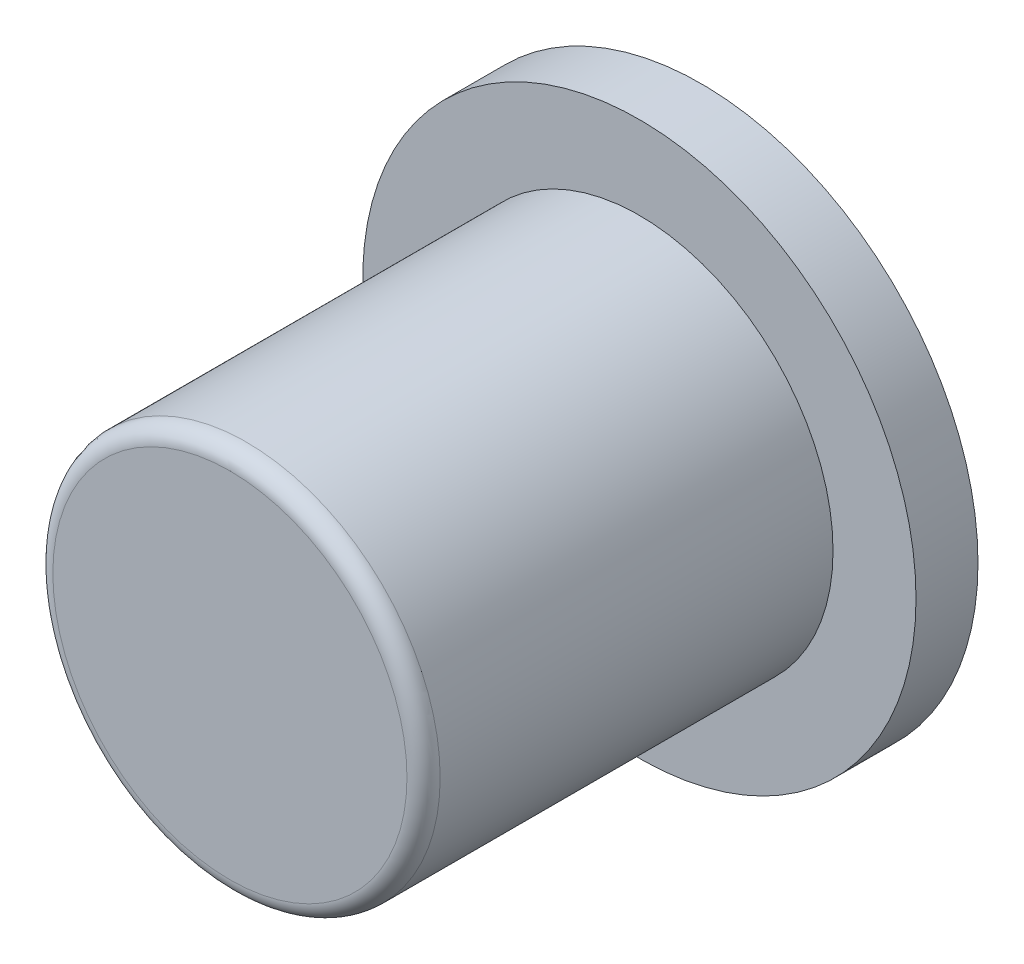
ISO-10303-21;
HEADER;
FILE_DESCRIPTION(('STEP AP214'),'2;1');
FILE_NAME('part.step','',(''),(''),'','','');
FILE_SCHEMA(('AUTOMOTIVE_DESIGN { 1 0 10303 214 1 1 1 1 }'));
ENDSEC;
DATA;
#1=APPLICATION_CONTEXT('core data for automotive mechanical design processes');
#2=APPLICATION_PROTOCOL_DEFINITION('international standard','automotive_design',2000,#1);
#3=PRODUCT_CONTEXT('',#1,'mechanical');
#4=PRODUCT('Part','Part','',(#3));
#5=PRODUCT_RELATED_PRODUCT_CATEGORY('part','',(#4));
#6=PRODUCT_DEFINITION_FORMATION('','',#4);
#7=PRODUCT_DEFINITION_CONTEXT('part definition',#1,'design');
#8=PRODUCT_DEFINITION('design','',#6,#7);
#9=PRODUCT_DEFINITION_SHAPE('','',#8);
#10=(LENGTH_UNIT() NAMED_UNIT(*) SI_UNIT(.MILLI.,.METRE.));
#11=(NAMED_UNIT(*) PLANE_ANGLE_UNIT() SI_UNIT($,.RADIAN.));
#12=(NAMED_UNIT(*) SI_UNIT($,.STERADIAN.) SOLID_ANGLE_UNIT());
#13=UNCERTAINTY_MEASURE_WITH_UNIT(LENGTH_MEASURE(1.E-05),#10,'distance_accuracy_value','');
#14=(GEOMETRIC_REPRESENTATION_CONTEXT(3) GLOBAL_UNCERTAINTY_ASSIGNED_CONTEXT((#13)) GLOBAL_UNIT_ASSIGNED_CONTEXT((#10,
#11,#12)) REPRESENTATION_CONTEXT('',''));
#15=CARTESIAN_POINT('',(0.,0.,0.));
#16=DIRECTION('',(0.,0.,1.));
#17=DIRECTION('',(1.,0.,0.));
#18=AXIS2_PLACEMENT_3D('',#15,#16,#17);
#19=CARTESIAN_POINT('',(-0.704816582600116,-0.704816582600116,0.25));
#20=DIRECTION('',(0.,0.,1.));
#21=DIRECTION('',(1.,0.,0.));
#22=AXIS2_PLACEMENT_3D('',#19,#20,#21);
#23=PLANE('',#22);
#24=DIRECTION('',(1.,0.,0.));
#25=VECTOR('',#24,1.);
#26=CARTESIAN_POINT('',(-0.704816582600116,-0.15,0.25));
#27=LINE('',#26,#25);
#28=CARTESIAN_POINT('',(-0.86538032812543,-0.15,0.25));
#29=VERTEX_POINT('',#28);
#30=CARTESIAN_POINT('',(-1.27850571724154,-0.15,0.25));
#31=VERTEX_POINT('',#30);
#32=EDGE_CURVE('E196',#29,#31,#27,.F.);
#33=ORIENTED_EDGE('',*,*,#32,.F.);
#34=CARTESIAN_POINT('',(0.,0.,0.25));
#35=DIRECTION('',(0.,0.,1.));
#36=DIRECTION('',(1.,0.,0.));
#37=AXIS2_PLACEMENT_3D('',#34,#35,#36);
#38=CIRCLE('',#37,0.878284186528755);
#39=CARTESIAN_POINT('',(-0.15,-0.86538032812543,0.25));
#40=VERTEX_POINT('',#39);
#41=EDGE_CURVE('E177',#40,#29,#38,.F.);
#42=ORIENTED_EDGE('',*,*,#41,.F.);
#43=DIRECTION('',(0.,1.,0.));
#44=VECTOR('',#43,1.);
#45=CARTESIAN_POINT('',(-0.15,-0.86538032812543,0.25));
#46=LINE('',#45,#44);
#47=CARTESIAN_POINT('',(-0.15,-1.27850571724154,0.25));
#48=VERTEX_POINT('',#47);
#49=EDGE_CURVE('E180',#40,#48,#46,.F.);
#50=ORIENTED_EDGE('',*,*,#49,.T.);
#51=CARTESIAN_POINT('',(0.,0.,0.25));
#52=DIRECTION('',(0.,0.,1.));
#53=DIRECTION('',(1.,0.,0.));
#54=AXIS2_PLACEMENT_3D('',#51,#52,#53);
#55=CIRCLE('',#54,1.28727497801337);
#56=EDGE_CURVE('E20',#48,#31,#55,.F.);
#57=ORIENTED_EDGE('',*,*,#56,.T.);
#58=EDGE_LOOP('',(#33,#42,#50,#57));
#59=FACE_BOUND('',#58,.T.);
#60=ADVANCED_FACE('F16',(#59),#23,.F.);
#61=CARTESIAN_POINT('',(0.704816582600116,-0.704816582600116,0.25));
#62=DIRECTION('',(0.,0.,1.));
#63=DIRECTION('',(1.,0.,0.));
#64=AXIS2_PLACEMENT_3D('',#61,#62,#63);
#65=PLANE('',#64);
#66=DIRECTION('',(1.,0.,0.));
#67=VECTOR('',#66,1.);
#68=CARTESIAN_POINT('',(0.704816582600116,-0.15,0.25));
#69=LINE('',#68,#67);
#70=CARTESIAN_POINT('',(1.27850571724154,-0.15,0.25));
#71=VERTEX_POINT('',#70);
#72=CARTESIAN_POINT('',(0.86538032812543,-0.15,0.25));
#73=VERTEX_POINT('',#72);
#74=EDGE_CURVE('E199',#71,#73,#69,.F.);
#75=ORIENTED_EDGE('',*,*,#74,.F.);
#76=CARTESIAN_POINT('',(0.,0.,0.25));
#77=DIRECTION('',(0.,0.,1.));
#78=DIRECTION('',(1.,0.,0.));
#79=AXIS2_PLACEMENT_3D('',#76,#77,#78);
#80=CIRCLE('',#79,1.28727497801337);
#81=CARTESIAN_POINT('',(0.149999999999999,-1.27850571724154,0.25));
#82=VERTEX_POINT('',#81);
#83=EDGE_CURVE('E169',#71,#82,#80,.F.);
#84=ORIENTED_EDGE('',*,*,#83,.T.);
#85=DIRECTION('',(0.,1.,0.));
#86=VECTOR('',#85,1.);
#87=CARTESIAN_POINT('',(0.15,-1.27850571724154,0.25));
#88=LINE('',#87,#86);
#89=CARTESIAN_POINT('',(0.15,-0.86538032812543,0.25));
#90=VERTEX_POINT('',#89);
#91=EDGE_CURVE('E194',#82,#90,#88,.T.);
#92=ORIENTED_EDGE('',*,*,#91,.T.);
#93=CARTESIAN_POINT('',(0.,0.,0.25));
#94=DIRECTION('',(0.,0.,1.));
#95=DIRECTION('',(1.,0.,0.));
#96=AXIS2_PLACEMENT_3D('',#93,#94,#95);
#97=CIRCLE('',#96,0.878284186528755);
#98=EDGE_CURVE('E174',#73,#90,#97,.F.);
#99=ORIENTED_EDGE('',*,*,#98,.F.);
#100=EDGE_LOOP('',(#75,#84,#92,#99));
#101=FACE_BOUND('',#100,.T.);
#102=ADVANCED_FACE('F279',(#101),#65,.F.);
#103=CARTESIAN_POINT('',(0.704816582600116,0.704816582600116,0.25));
#104=DIRECTION('',(0.,0.,1.));
#105=DIRECTION('',(1.,0.,0.));
#106=AXIS2_PLACEMENT_3D('',#103,#104,#105);
#107=PLANE('',#106);
#108=DIRECTION('',(1.,0.,0.));
#109=VECTOR('',#108,1.);
#110=CARTESIAN_POINT('',(0.704816582600116,0.15,0.25));
#111=LINE('',#110,#109);
#112=CARTESIAN_POINT('',(0.86538032812543,0.15,0.25));
#113=VERTEX_POINT('',#112);
#114=CARTESIAN_POINT('',(1.27850571724154,0.15,0.25));
#115=VERTEX_POINT('',#114);
#116=EDGE_CURVE('E264',#113,#115,#111,.T.);
#117=ORIENTED_EDGE('',*,*,#116,.F.);
#118=CARTESIAN_POINT('',(0.,0.,0.25));
#119=DIRECTION('',(0.,0.,1.));
#120=DIRECTION('',(1.,0.,0.));
#121=AXIS2_PLACEMENT_3D('',#118,#119,#120);
#122=CIRCLE('',#121,0.878284186528755);
#123=CARTESIAN_POINT('',(0.15,0.86538032812543,0.25));
#124=VERTEX_POINT('',#123);
#125=EDGE_CURVE('E159',#124,#113,#122,.F.);
#126=ORIENTED_EDGE('',*,*,#125,.F.);
#127=DIRECTION('',(0.,1.,0.));
#128=VECTOR('',#127,1.);
#129=CARTESIAN_POINT('',(0.15,0.86538032812543,0.25));
#130=LINE('',#129,#128);
#131=CARTESIAN_POINT('',(0.15,1.27850571724154,0.25));
#132=VERTEX_POINT('',#131);
#133=EDGE_CURVE('E163',#124,#132,#130,.T.);
#134=ORIENTED_EDGE('',*,*,#133,.T.);
#135=CARTESIAN_POINT('',(0.,0.,0.25));
#136=DIRECTION('',(0.,0.,1.));
#137=DIRECTION('',(1.,0.,0.));
#138=AXIS2_PLACEMENT_3D('',#135,#136,#137);
#139=CIRCLE('',#138,1.28727497801337);
#140=EDGE_CURVE('E164',#132,#115,#139,.F.);
#141=ORIENTED_EDGE('',*,*,#140,.T.);
#142=EDGE_LOOP('',(#117,#126,#134,#141));
#143=FACE_BOUND('',#142,.T.);
#144=ADVANCED_FACE('F401',(#143),#107,.F.);
#145=CARTESIAN_POINT('',(-0.704816582600116,0.704816582600116,0.25));
#146=DIRECTION('',(0.,0.,1.));
#147=DIRECTION('',(1.,0.,0.));
#148=AXIS2_PLACEMENT_3D('',#145,#146,#147);
#149=PLANE('',#148);
#150=DIRECTION('',(1.,0.,0.));
#151=VECTOR('',#150,1.);
#152=CARTESIAN_POINT('',(-0.704816582600116,0.15,0.25));
#153=LINE('',#152,#151);
#154=CARTESIAN_POINT('',(-1.27850571724154,0.15,0.25));
#155=VERTEX_POINT('',#154);
#156=CARTESIAN_POINT('',(-0.86538032812543,0.15,0.25));
#157=VERTEX_POINT('',#156);
#158=EDGE_CURVE('E262',#155,#157,#153,.T.);
#159=ORIENTED_EDGE('',*,*,#158,.F.);
#160=CARTESIAN_POINT('',(0.,0.,0.25));
#161=DIRECTION('',(0.,0.,1.));
#162=DIRECTION('',(1.,0.,0.));
#163=AXIS2_PLACEMENT_3D('',#160,#161,#162);
#164=CIRCLE('',#163,1.28727497801337);
#165=CARTESIAN_POINT('',(-0.15,1.27850571724154,0.25));
#166=VERTEX_POINT('',#165);
#167=EDGE_CURVE('E151',#155,#166,#164,.F.);
#168=ORIENTED_EDGE('',*,*,#167,.T.);
#169=DIRECTION('',(0.,1.,0.));
#170=VECTOR('',#169,1.);
#171=CARTESIAN_POINT('',(-0.15,1.27850571724154,0.25));
#172=LINE('',#171,#170);
#173=CARTESIAN_POINT('',(-0.15,0.86538032812543,0.25));
#174=VERTEX_POINT('',#173);
#175=EDGE_CURVE('E246',#166,#174,#172,.F.);
#176=ORIENTED_EDGE('',*,*,#175,.T.);
#177=CARTESIAN_POINT('',(0.,0.,0.25));
#178=DIRECTION('',(0.,0.,1.));
#179=DIRECTION('',(1.,0.,0.));
#180=AXIS2_PLACEMENT_3D('',#177,#178,#179);
#181=CIRCLE('',#180,0.878284186528755);
#182=EDGE_CURVE('E155',#157,#174,#181,.F.);
#183=ORIENTED_EDGE('',*,*,#182,.F.);
#184=EDGE_LOOP('',(#159,#168,#176,#183));
#185=FACE_BOUND('',#184,.T.);
#186=ADVANCED_FACE('F136',(#185),#149,.F.);
#187=CARTESIAN_POINT('',(-0.0459534111812262,0.,0.25));
#188=DIRECTION('',(0.,-1.,0.));
#189=DIRECTION('',(1.,0.,0.));
#190=AXIS2_PLACEMENT_3D('',#187,#188,#189);
#191=CIRCLE('',#190,0.911333739306657);
#192=TRIMMED_CURVE('',#191,(PARAMETER_VALUE(-1.52035058430503)),
(PARAMETER_VALUE(1.52035058430503)),.T.,.PARAMETER.);
#193=CARTESIAN_POINT('',(0.,0.,0.25));
#194=DIRECTION('',(0.,0.,1.));
#195=AXIS1_PLACEMENT('',#193,#194);
#196=SURFACE_OF_REVOLUTION('',#192,#195);
#197=CARTESIAN_POINT('',(0.,0.,-0.660174416471625));
#198=VERTEX_POINT('',#197);
#199=VERTEX_LOOP('',#198);
#200=FACE_BOUND('',#199,.T.);
#201=CARTESIAN_POINT('',(0.,0.,0.));
#202=DIRECTION('',(0.,0.,1.));
#203=DIRECTION('',(1.,0.,0.));
#204=AXIS2_PLACEMENT_3D('',#201,#202,#203);
#205=CIRCLE('',#204,0.830419331662054);
#206=CARTESIAN_POINT('',(0.830419331662053,0.,0.));
#207=VERTEX_POINT('',#206);
#208=EDGE_CURVE('E139',#207,#207,#205,.T.);
#209=ORIENTED_EDGE('',*,*,#208,.F.);
#210=EDGE_LOOP('',(#209));
#211=FACE_BOUND('',#210,.T.);
#212=ADVANCED_FACE('F18',(#200,#211),#196,.T.);
#213=CARTESIAN_POINT('',(0.,0.,0.));
#214=DIRECTION('',(0.,0.,1.));
#215=DIRECTION('',(1.,0.,0.));
#216=AXIS2_PLACEMENT_3D('',#213,#214,#215);
#217=CYLINDRICAL_SURFACE('',#216,1.28727497801337);
#218=DIRECTION('',(0.,0.,-1.));
#219=VECTOR('',#218,1.);
#220=CARTESIAN_POINT('',(-0.15,-1.27850571724154,0.));
#221=LINE('',#220,#219);
#222=CARTESIAN_POINT('',(-0.15,-1.27850571724154,0.));
#223=VERTEX_POINT('',#222);
#224=EDGE_CURVE('E186',#48,#223,#221,.T.);
#225=ORIENTED_EDGE('',*,*,#224,.T.);
#226=CARTESIAN_POINT('',(0.,0.,0.));
#227=DIRECTION('',(0.,0.,1.));
#228=DIRECTION('',(1.,0.,0.));
#229=AXIS2_PLACEMENT_3D('',#226,#227,#228);
#230=CIRCLE('',#229,1.28727497801337);
#231=CARTESIAN_POINT('',(-1.27850571724154,-0.15,0.));
#232=VERTEX_POINT('',#231);
#233=EDGE_CURVE('E141',#232,#223,#230,.T.);
#234=ORIENTED_EDGE('',*,*,#233,.F.);
#235=DIRECTION('',(0.,0.,1.));
#236=VECTOR('',#235,1.);
#237=CARTESIAN_POINT('',(-1.27850571724154,-0.15,0.));
#238=LINE('',#237,#236);
#239=EDGE_CURVE('E176',#232,#31,#238,.T.);
#240=ORIENTED_EDGE('',*,*,#239,.T.);
#241=ORIENTED_EDGE('',*,*,#56,.F.);
#242=EDGE_LOOP('',(#225,#234,#240,#241));
#243=FACE_BOUND('',#242,.T.);
#244=ADVANCED_FACE('F135',(#243),#217,.F.);
#245=CARTESIAN_POINT('',(-0.15,-0.86538032812543,0.));
#246=DIRECTION('',(1.,0.,0.));
#247=DIRECTION('',(0.,0.,-1.));
#248=AXIS2_PLACEMENT_3D('',#245,#246,#247);
#249=PLANE('',#248);
#250=DIRECTION('',(0.,0.,1.));
#251=VECTOR('',#250,1.);
#252=CARTESIAN_POINT('',(-0.15,-0.86538032812543,0.));
#253=LINE('',#252,#251);
#254=CARTESIAN_POINT('',(-0.15,-0.86538032812543,0.));
#255=VERTEX_POINT('',#254);
#256=EDGE_CURVE('E179',#255,#40,#253,.T.);
#257=ORIENTED_EDGE('',*,*,#256,.F.);
#258=DIRECTION('',(0.,1.,0.));
#259=VECTOR('',#258,1.);
#260=CARTESIAN_POINT('',(-0.15,0.,0.));
#261=LINE('',#260,#259);
#262=EDGE_CURVE('E145',#223,#255,#261,.T.);
#263=ORIENTED_EDGE('',*,*,#262,.F.);
#264=ORIENTED_EDGE('',*,*,#224,.F.);
#265=ORIENTED_EDGE('',*,*,#49,.F.);
#266=EDGE_LOOP('',(#257,#263,#264,#265));
#267=FACE_BOUND('',#266,.T.);
#268=ADVANCED_FACE('F393',(#267),#249,.F.);
#269=CARTESIAN_POINT('',(0.,0.,0.));
#270=DIRECTION('',(0.,0.,1.));
#271=DIRECTION('',(1.,0.,0.));
#272=AXIS2_PLACEMENT_3D('',#269,#270,#271);
#273=CYLINDRICAL_SURFACE('',#272,0.878284186528755);
#274=CARTESIAN_POINT('',(0.,0.,0.));
#275=DIRECTION('',(0.,0.,1.));
#276=DIRECTION('',(1.,0.,0.));
#277=AXIS2_PLACEMENT_3D('',#274,#275,#276);
#278=CIRCLE('',#277,0.878284186528755);
#279=CARTESIAN_POINT('',(-0.86538032812543,-0.15,0.));
#280=VERTEX_POINT('',#279);
#281=EDGE_CURVE('E233',#255,#280,#278,.F.);
#282=ORIENTED_EDGE('',*,*,#281,.F.);
#283=ORIENTED_EDGE('',*,*,#256,.T.);
#284=ORIENTED_EDGE('',*,*,#41,.T.);
#285=DIRECTION('',(0.,0.,1.));
#286=VECTOR('',#285,1.);
#287=CARTESIAN_POINT('',(-0.86538032812543,-0.15,0.));
#288=LINE('',#287,#286);
#289=EDGE_CURVE('E184',#29,#280,#288,.F.);
#290=ORIENTED_EDGE('',*,*,#289,.T.);
#291=EDGE_LOOP('',(#282,#283,#284,#290));
#292=FACE_BOUND('',#291,.T.);
#293=ADVANCED_FACE('F389',(#292),#273,.T.);
#294=CARTESIAN_POINT('',(-1.27850571724154,-0.15,0.));
#295=DIRECTION('',(0.,1.,0.));
#296=DIRECTION('',(0.,0.,1.));
#297=AXIS2_PLACEMENT_3D('',#294,#295,#296);
#298=PLANE('',#297);
#299=ORIENTED_EDGE('',*,*,#239,.F.);
#300=DIRECTION('',(-1.,0.,0.));
#301=VECTOR('',#300,1.);
#302=CARTESIAN_POINT('',(0.,-0.15,0.));
#303=LINE('',#302,#301);
#304=EDGE_CURVE('E232',#280,#232,#303,.T.);
#305=ORIENTED_EDGE('',*,*,#304,.F.);
#306=ORIENTED_EDGE('',*,*,#289,.F.);
#307=ORIENTED_EDGE('',*,*,#32,.T.);
#308=EDGE_LOOP('',(#299,#305,#306,#307));
#309=FACE_BOUND('',#308,.T.);
#310=ADVANCED_FACE('F386',(#309),#298,.F.);
#311=CARTESIAN_POINT('',(0.,0.,0.));
#312=DIRECTION('',(0.,0.,1.));
#313=DIRECTION('',(1.,0.,0.));
#314=AXIS2_PLACEMENT_3D('',#311,#312,#313);
#315=CYLINDRICAL_SURFACE('',#314,0.878284186528755);
#316=CARTESIAN_POINT('',(0.,0.,0.));
#317=DIRECTION('',(0.,0.,1.));
#318=DIRECTION('',(1.,0.,0.));
#319=AXIS2_PLACEMENT_3D('',#316,#317,#318);
#320=CIRCLE('',#319,0.878284186528755);
#321=CARTESIAN_POINT('',(0.86538032812543,-0.15,0.));
#322=VERTEX_POINT('',#321);
#323=CARTESIAN_POINT('',(0.15,-0.86538032812543,0.));
#324=VERTEX_POINT('',#323);
#325=EDGE_CURVE('E230',#322,#324,#320,.F.);
#326=ORIENTED_EDGE('',*,*,#325,.F.);
#327=DIRECTION('',(0.,0.,1.));
#328=VECTOR('',#327,1.);
#329=CARTESIAN_POINT('',(0.86538032812543,-0.15,0.));
#330=LINE('',#329,#328);
#331=EDGE_CURVE('E168',#322,#73,#330,.T.);
#332=ORIENTED_EDGE('',*,*,#331,.T.);
#333=ORIENTED_EDGE('',*,*,#98,.T.);
#334=DIRECTION('',(0.,0.,1.));
#335=VECTOR('',#334,1.);
#336=CARTESIAN_POINT('',(0.15,-0.86538032812543,0.));
#337=LINE('',#336,#335);
#338=EDGE_CURVE('E175',#90,#324,#337,.F.);
#339=ORIENTED_EDGE('',*,*,#338,.T.);
#340=EDGE_LOOP('',(#326,#332,#333,#339));
#341=FACE_BOUND('',#340,.T.);
#342=ADVANCED_FACE('F282',(#341),#315,.T.);
#343=CARTESIAN_POINT('',(0.15,-1.27850571724154,0.));
#344=DIRECTION('',(-1.,0.,0.));
#345=DIRECTION('',(0.,0.,1.));
#346=AXIS2_PLACEMENT_3D('',#343,#344,#345);
#347=PLANE('',#346);
#348=DIRECTION('',(0.,0.,1.));
#349=VECTOR('',#348,1.);
#350=CARTESIAN_POINT('',(0.149999999999999,-1.27850571724154,0.));
#351=LINE('',#350,#349);
#352=CARTESIAN_POINT('',(0.149999999999999,-1.27850571724154,0.));
#353=VERTEX_POINT('',#352);
#354=EDGE_CURVE('E173',#82,#353,#351,.F.);
#355=ORIENTED_EDGE('',*,*,#354,.T.);
#356=DIRECTION('',(0.,1.,0.));
#357=VECTOR('',#356,1.);
#358=CARTESIAN_POINT('',(0.15,0.,0.));
#359=LINE('',#358,#357);
#360=EDGE_CURVE('E229',#324,#353,#359,.F.);
#361=ORIENTED_EDGE('',*,*,#360,.F.);
#362=ORIENTED_EDGE('',*,*,#338,.F.);
#363=ORIENTED_EDGE('',*,*,#91,.F.);
#364=EDGE_LOOP('',(#355,#361,#362,#363));
#365=FACE_BOUND('',#364,.T.);
#366=ADVANCED_FACE('F379',(#365),#347,.F.);
#367=CARTESIAN_POINT('',(0.,0.,0.));
#368=DIRECTION('',(0.,0.,1.));
#369=DIRECTION('',(1.,0.,0.));
#370=AXIS2_PLACEMENT_3D('',#367,#368,#369);
#371=CYLINDRICAL_SURFACE('',#370,1.28727497801337);
#372=DIRECTION('',(0.,0.,1.));
#373=VECTOR('',#372,1.);
#374=CARTESIAN_POINT('',(1.27850571724154,-0.15,0.));
#375=LINE('',#374,#373);
#376=CARTESIAN_POINT('',(1.27850571724154,-0.15,0.));
#377=VERTEX_POINT('',#376);
#378=EDGE_CURVE('E172',#71,#377,#375,.F.);
#379=ORIENTED_EDGE('',*,*,#378,.T.);
#380=CARTESIAN_POINT('',(0.,0.,0.));
#381=DIRECTION('',(0.,0.,1.));
#382=DIRECTION('',(1.,0.,0.));
#383=AXIS2_PLACEMENT_3D('',#380,#381,#382);
#384=CIRCLE('',#383,1.28727497801337);
#385=EDGE_CURVE('E226',#353,#377,#384,.T.);
#386=ORIENTED_EDGE('',*,*,#385,.F.);
#387=ORIENTED_EDGE('',*,*,#354,.F.);
#388=ORIENTED_EDGE('',*,*,#83,.F.);
#389=EDGE_LOOP('',(#379,#386,#387,#388));
#390=FACE_BOUND('',#389,.T.);
#391=ADVANCED_FACE('F376',(#390),#371,.F.);
#392=CARTESIAN_POINT('',(0.86538032812543,-0.15,0.));
#393=DIRECTION('',(0.,1.,0.));
#394=DIRECTION('',(0.,0.,1.));
#395=AXIS2_PLACEMENT_3D('',#392,#393,#394);
#396=PLANE('',#395);
#397=ORIENTED_EDGE('',*,*,#331,.F.);
#398=DIRECTION('',(-1.,0.,0.));
#399=VECTOR('',#398,1.);
#400=CARTESIAN_POINT('',(0.,-0.15,0.));
#401=LINE('',#400,#399);
#402=EDGE_CURVE('E225',#377,#322,#401,.T.);
#403=ORIENTED_EDGE('',*,*,#402,.F.);
#404=ORIENTED_EDGE('',*,*,#378,.F.);
#405=ORIENTED_EDGE('',*,*,#74,.T.);
#406=EDGE_LOOP('',(#397,#403,#404,#405));
#407=FACE_BOUND('',#406,.T.);
#408=ADVANCED_FACE('F273',(#407),#396,.F.);
#409=CARTESIAN_POINT('',(0.,0.,0.));
#410=DIRECTION('',(0.,0.,1.));
#411=DIRECTION('',(1.,0.,0.));
#412=AXIS2_PLACEMENT_3D('',#409,#410,#411);
#413=CYLINDRICAL_SURFACE('',#412,1.28727497801337);
#414=DIRECTION('',(0.,0.,1.));
#415=VECTOR('',#414,1.);
#416=CARTESIAN_POINT('',(0.15,1.27850571724154,0.));
#417=LINE('',#416,#415);
#418=CARTESIAN_POINT('',(0.15,1.27850571724154,0.));
#419=VERTEX_POINT('',#418);
#420=EDGE_CURVE('E167',#132,#419,#417,.F.);
#421=ORIENTED_EDGE('',*,*,#420,.T.);
#422=CARTESIAN_POINT('',(0.,0.,0.));
#423=DIRECTION('',(0.,0.,1.));
#424=DIRECTION('',(1.,0.,0.));
#425=AXIS2_PLACEMENT_3D('',#422,#423,#424);
#426=CIRCLE('',#425,1.28727497801337);
#427=CARTESIAN_POINT('',(1.27850571724154,0.15,0.));
#428=VERTEX_POINT('',#427);
#429=EDGE_CURVE('E222',#428,#419,#426,.T.);
#430=ORIENTED_EDGE('',*,*,#429,.F.);
#431=DIRECTION('',(0.,0.,-1.));
#432=VECTOR('',#431,1.);
#433=CARTESIAN_POINT('',(1.27850571724154,0.15,0.));
#434=LINE('',#433,#432);
#435=EDGE_CURVE('E158',#428,#115,#434,.F.);
#436=ORIENTED_EDGE('',*,*,#435,.T.);
#437=ORIENTED_EDGE('',*,*,#140,.F.);
#438=EDGE_LOOP('',(#421,#430,#436,#437));
#439=FACE_BOUND('',#438,.T.);
#440=ADVANCED_FACE('F369',(#439),#413,.F.);
#441=CARTESIAN_POINT('',(0.15,0.86538032812543,0.));
#442=DIRECTION('',(-1.,0.,0.));
#443=DIRECTION('',(0.,0.,1.));
#444=AXIS2_PLACEMENT_3D('',#441,#442,#443);
#445=PLANE('',#444);
#446=DIRECTION('',(0.,0.,1.));
#447=VECTOR('',#446,1.);
#448=CARTESIAN_POINT('',(0.15,0.86538032812543,0.));
#449=LINE('',#448,#447);
#450=CARTESIAN_POINT('',(0.15,0.86538032812543,0.));
#451=VERTEX_POINT('',#450);
#452=EDGE_CURVE('E162',#451,#124,#449,.T.);
#453=ORIENTED_EDGE('',*,*,#452,.F.);
#454=DIRECTION('',(0.,1.,0.));
#455=VECTOR('',#454,1.);
#456=CARTESIAN_POINT('',(0.15,0.,0.));
#457=LINE('',#456,#455);
#458=EDGE_CURVE('E221',#419,#451,#457,.F.);
#459=ORIENTED_EDGE('',*,*,#458,.F.);
#460=ORIENTED_EDGE('',*,*,#420,.F.);
#461=ORIENTED_EDGE('',*,*,#133,.F.);
#462=EDGE_LOOP('',(#453,#459,#460,#461));
#463=FACE_BOUND('',#462,.T.);
#464=ADVANCED_FACE('F365',(#463),#445,.F.);
#465=CARTESIAN_POINT('',(0.,0.,0.));
#466=DIRECTION('',(0.,0.,1.));
#467=DIRECTION('',(1.,0.,0.));
#468=AXIS2_PLACEMENT_3D('',#465,#466,#467);
#469=CYLINDRICAL_SURFACE('',#468,0.878284186528755);
#470=CARTESIAN_POINT('',(0.,0.,0.));
#471=DIRECTION('',(0.,0.,1.));
#472=DIRECTION('',(1.,0.,0.));
#473=AXIS2_PLACEMENT_3D('',#470,#471,#472);
#474=CIRCLE('',#473,0.878284186528755);
#475=CARTESIAN_POINT('',(0.86538032812543,0.15,0.));
#476=VERTEX_POINT('',#475);
#477=EDGE_CURVE('E218',#451,#476,#474,.F.);
#478=ORIENTED_EDGE('',*,*,#477,.F.);
#479=ORIENTED_EDGE('',*,*,#452,.T.);
#480=ORIENTED_EDGE('',*,*,#125,.T.);
#481=DIRECTION('',(0.,0.,-1.));
#482=VECTOR('',#481,1.);
#483=CARTESIAN_POINT('',(0.86538032812543,0.15,0.));
#484=LINE('',#483,#482);
#485=EDGE_CURVE('E248',#113,#476,#484,.T.);
#486=ORIENTED_EDGE('',*,*,#485,.T.);
#487=EDGE_LOOP('',(#478,#479,#480,#486));
#488=FACE_BOUND('',#487,.T.);
#489=ADVANCED_FACE('F361',(#488),#469,.T.);
#490=CARTESIAN_POINT('',(1.27850571724154,0.15,0.));
#491=DIRECTION('',(0.,-1.,0.));
#492=DIRECTION('',(0.,0.,-1.));
#493=AXIS2_PLACEMENT_3D('',#490,#491,#492);
#494=PLANE('',#493);
#495=ORIENTED_EDGE('',*,*,#435,.F.);
#496=DIRECTION('',(-1.,0.,0.));
#497=VECTOR('',#496,1.);
#498=CARTESIAN_POINT('',(0.,0.15,0.));
#499=LINE('',#498,#497);
#500=EDGE_CURVE('E217',#476,#428,#499,.F.);
#501=ORIENTED_EDGE('',*,*,#500,.F.);
#502=ORIENTED_EDGE('',*,*,#485,.F.);
#503=ORIENTED_EDGE('',*,*,#116,.T.);
#504=EDGE_LOOP('',(#495,#501,#502,#503));
#505=FACE_BOUND('',#504,.T.);
#506=ADVANCED_FACE('F357',(#505),#494,.F.);
#507=CARTESIAN_POINT('',(0.,0.,0.));
#508=DIRECTION('',(0.,0.,1.));
#509=DIRECTION('',(1.,0.,0.));
#510=AXIS2_PLACEMENT_3D('',#507,#508,#509);
#511=CYLINDRICAL_SURFACE('',#510,0.878284186528755);
#512=CARTESIAN_POINT('',(0.,0.,0.));
#513=DIRECTION('',(0.,0.,1.));
#514=DIRECTION('',(1.,0.,0.));
#515=AXIS2_PLACEMENT_3D('',#512,#513,#514);
#516=CIRCLE('',#515,0.878284186528755);
#517=CARTESIAN_POINT('',(-0.86538032812543,0.15,0.));
#518=VERTEX_POINT('',#517);
#519=CARTESIAN_POINT('',(-0.15,0.86538032812543,0.));
#520=VERTEX_POINT('',#519);
#521=EDGE_CURVE('E214',#518,#520,#516,.F.);
#522=ORIENTED_EDGE('',*,*,#521,.F.);
#523=DIRECTION('',(0.,0.,-1.));
#524=VECTOR('',#523,1.);
#525=CARTESIAN_POINT('',(-0.86538032812543,0.15,0.));
#526=LINE('',#525,#524);
#527=EDGE_CURVE('E142',#518,#157,#526,.F.);
#528=ORIENTED_EDGE('',*,*,#527,.T.);
#529=ORIENTED_EDGE('',*,*,#182,.T.);
#530=DIRECTION('',(0.,0.,-1.));
#531=VECTOR('',#530,1.);
#532=CARTESIAN_POINT('',(-0.15,0.86538032812543,0.));
#533=LINE('',#532,#531);
#534=EDGE_CURVE('E157',#174,#520,#533,.T.);
#535=ORIENTED_EDGE('',*,*,#534,.T.);
#536=EDGE_LOOP('',(#522,#528,#529,#535));
#537=FACE_BOUND('',#536,.T.);
#538=ADVANCED_FACE('F353',(#537),#511,.T.);
#539=CARTESIAN_POINT('',(-0.15,1.27850571724154,0.));
#540=DIRECTION('',(1.,0.,0.));
#541=DIRECTION('',(0.,0.,-1.));
#542=AXIS2_PLACEMENT_3D('',#539,#540,#541);
#543=PLANE('',#542);
#544=DIRECTION('',(0.,0.,1.));
#545=VECTOR('',#544,1.);
#546=CARTESIAN_POINT('',(-0.15,1.27850571724154,0.));
#547=LINE('',#546,#545);
#548=CARTESIAN_POINT('',(-0.15,1.27850571724154,0.));
#549=VERTEX_POINT('',#548);
#550=EDGE_CURVE('E154',#166,#549,#547,.F.);
#551=ORIENTED_EDGE('',*,*,#550,.T.);
#552=DIRECTION('',(0.,1.,0.));
#553=VECTOR('',#552,1.);
#554=CARTESIAN_POINT('',(-0.15,0.,0.));
#555=LINE('',#554,#553);
#556=EDGE_CURVE('E213',#520,#549,#555,.T.);
#557=ORIENTED_EDGE('',*,*,#556,.F.);
#558=ORIENTED_EDGE('',*,*,#534,.F.);
#559=ORIENTED_EDGE('',*,*,#175,.F.);
#560=EDGE_LOOP('',(#551,#557,#558,#559));
#561=FACE_BOUND('',#560,.T.);
#562=ADVANCED_FACE('F350',(#561),#543,.F.);
#563=CARTESIAN_POINT('',(0.,0.,0.));
#564=DIRECTION('',(0.,0.,1.));
#565=DIRECTION('',(1.,0.,0.));
#566=AXIS2_PLACEMENT_3D('',#563,#564,#565);
#567=CYLINDRICAL_SURFACE('',#566,1.28727497801337);
#568=DIRECTION('',(0.,0.,-1.));
#569=VECTOR('',#568,1.);
#570=CARTESIAN_POINT('',(-1.27850571724154,0.15,0.));
#571=LINE('',#570,#569);
#572=CARTESIAN_POINT('',(-1.27850571724154,0.15,0.));
#573=VERTEX_POINT('',#572);
#574=EDGE_CURVE('E35',#155,#573,#571,.T.);
#575=ORIENTED_EDGE('',*,*,#574,.T.);
#576=CARTESIAN_POINT('',(0.,0.,0.));
#577=DIRECTION('',(0.,0.,1.));
#578=DIRECTION('',(1.,0.,0.));
#579=AXIS2_PLACEMENT_3D('',#576,#577,#578);
#580=CIRCLE('',#579,1.28727497801337);
#581=EDGE_CURVE('E210',#549,#573,#580,.T.);
#582=ORIENTED_EDGE('',*,*,#581,.F.);
#583=ORIENTED_EDGE('',*,*,#550,.F.);
#584=ORIENTED_EDGE('',*,*,#167,.F.);
#585=EDGE_LOOP('',(#575,#582,#583,#584));
#586=FACE_BOUND('',#585,.T.);
#587=ADVANCED_FACE('F346',(#586),#567,.F.);
#588=CARTESIAN_POINT('',(-0.86538032812543,0.15,0.));
#589=DIRECTION('',(0.,-1.,0.));
#590=DIRECTION('',(0.,0.,-1.));
#591=AXIS2_PLACEMENT_3D('',#588,#589,#590);
#592=PLANE('',#591);
#593=ORIENTED_EDGE('',*,*,#527,.F.);
#594=DIRECTION('',(-1.,0.,0.));
#595=VECTOR('',#594,1.);
#596=CARTESIAN_POINT('',(0.,0.15,0.));
#597=LINE('',#596,#595);
#598=EDGE_CURVE('E209',#573,#518,#597,.F.);
#599=ORIENTED_EDGE('',*,*,#598,.F.);
#600=ORIENTED_EDGE('',*,*,#574,.F.);
#601=ORIENTED_EDGE('',*,*,#158,.T.);
#602=EDGE_LOOP('',(#593,#599,#600,#601));
#603=FACE_BOUND('',#602,.T.);
#604=ADVANCED_FACE('F342',(#603),#592,.F.);
#605=CARTESIAN_POINT('',(0.,0.,0.));
#606=DIRECTION('',(0.,0.,-1.));
#607=DIRECTION('',(-1.,0.,0.));
#608=AXIS2_PLACEMENT_3D('',#605,#606,#607);
#609=PLANE('',#608);
#610=ORIENTED_EDGE('',*,*,#581,.T.);
#611=ORIENTED_EDGE('',*,*,#598,.T.);
#612=ORIENTED_EDGE('',*,*,#521,.T.);
#613=ORIENTED_EDGE('',*,*,#556,.T.);
#614=EDGE_LOOP('',(#610,#611,#612,#613));
#615=FACE_BOUND('',#614,.T.);
#616=ORIENTED_EDGE('',*,*,#477,.T.);
#617=ORIENTED_EDGE('',*,*,#500,.T.);
#618=ORIENTED_EDGE('',*,*,#429,.T.);
#619=ORIENTED_EDGE('',*,*,#458,.T.);
#620=EDGE_LOOP('',(#616,#617,#618,#619));
#621=FACE_BOUND('',#620,.T.);
#622=ORIENTED_EDGE('',*,*,#385,.T.);
#623=ORIENTED_EDGE('',*,*,#402,.T.);
#624=ORIENTED_EDGE('',*,*,#325,.T.);
#625=ORIENTED_EDGE('',*,*,#360,.T.);
#626=EDGE_LOOP('',(#622,#623,#624,#625));
#627=FACE_BOUND('',#626,.T.);
#628=ORIENTED_EDGE('',*,*,#281,.T.);
#629=ORIENTED_EDGE('',*,*,#304,.T.);
#630=ORIENTED_EDGE('',*,*,#233,.T.);
#631=ORIENTED_EDGE('',*,*,#262,.T.);
#632=EDGE_LOOP('',(#628,#629,#630,#631));
#633=FACE_BOUND('',#632,.T.);
#634=ORIENTED_EDGE('',*,*,#208,.T.);
#635=EDGE_LOOP('',(#634));
#636=FACE_BOUND('',#635,.T.);
#637=CARTESIAN_POINT('',(0.,0.,0.));
#638=DIRECTION('',(0.,0.,1.));
#639=DIRECTION('',(1.,0.,0.));
#640=AXIS2_PLACEMENT_3D('',#637,#638,#639);
#641=CIRCLE('',#640,2.5);
#642=CARTESIAN_POINT('',(2.5,0.,0.));
#643=VERTEX_POINT('',#642);
#644=EDGE_CURVE('E206',#643,#643,#641,.T.);
#645=ORIENTED_EDGE('',*,*,#644,.F.);
#646=EDGE_LOOP('',(#645));
#647=FACE_BOUND('',#646,.T.);
#648=ADVANCED_FACE('F286',(#615,#621,#627,#633,#636,#647),#609,.T.);
#649=CARTESIAN_POINT('',(0.,0.,0.));
#650=DIRECTION('',(0.,0.,1.));
#651=DIRECTION('',(1.,0.,0.));
#652=AXIS2_PLACEMENT_3D('',#649,#650,#651);
#653=CYLINDRICAL_SURFACE('',#652,2.5);
#654=ORIENTED_EDGE('',*,*,#644,.T.);
#655=EDGE_LOOP('',(#654));
#656=FACE_BOUND('',#655,.T.);
#657=CARTESIAN_POINT('',(0.,0.,0.56));
#658=DIRECTION('',(0.,0.,1.));
#659=DIRECTION('',(1.,0.,0.));
#660=AXIS2_PLACEMENT_3D('',#657,#658,#659);
#661=CIRCLE('',#660,2.5);
#662=CARTESIAN_POINT('',(2.5,0.,0.56));
#663=VERTEX_POINT('',#662);
#664=EDGE_CURVE('E203',#663,#663,#661,.F.);
#665=ORIENTED_EDGE('',*,*,#664,.T.);
#666=EDGE_LOOP('',(#665));
#667=FACE_BOUND('',#666,.T.);
#668=ADVANCED_FACE('F336',(#656,#667),#653,.T.);
#669=CARTESIAN_POINT('',(0.,0.,4.26));
#670=DIRECTION('',(0.,0.,-1.));
#671=DIRECTION('',(-1.,0.,0.));
#672=AXIS2_PLACEMENT_3D('',#669,#670,#671);
#673=PLANE('',#672);
#674=CARTESIAN_POINT('',(0.,0.,4.26));
#675=DIRECTION('',(0.,0.,-1.));
#676=DIRECTION('',(1.,0.,0.));
#677=AXIS2_PLACEMENT_3D('',#674,#675,#676);
#678=CIRCLE('',#677,1.6);
#679=CARTESIAN_POINT('',(1.6,0.,4.26));
#680=VERTEX_POINT('',#679);
#681=EDGE_CURVE('E202',#680,#680,#678,.T.);
#682=ORIENTED_EDGE('',*,*,#681,.F.);
#683=EDGE_LOOP('',(#682));
#684=FACE_BOUND('',#683,.T.);
#685=ADVANCED_FACE('F327',(#684),#673,.F.);
#686=CARTESIAN_POINT('',(0.,0.,0.56));
#687=DIRECTION('',(0.,0.,-1.));
#688=DIRECTION('',(-1.,0.,0.));
#689=AXIS2_PLACEMENT_3D('',#686,#687,#688);
#690=PLANE('',#689);
#691=CARTESIAN_POINT('',(0.,0.,0.56));
#692=DIRECTION('',(0.,0.,1.));
#693=DIRECTION('',(1.,0.,0.));
#694=AXIS2_PLACEMENT_3D('',#691,#692,#693);
#695=CIRCLE('',#694,1.75);
#696=CARTESIAN_POINT('',(1.75,0.,0.56));
#697=VERTEX_POINT('',#696);
#698=EDGE_CURVE('E26',#697,#697,#695,.T.);
#699=ORIENTED_EDGE('',*,*,#698,.F.);
#700=EDGE_LOOP('',(#699));
#701=FACE_BOUND('',#700,.T.);
#702=ORIENTED_EDGE('',*,*,#664,.F.);
#703=EDGE_LOOP('',(#702));
#704=FACE_BOUND('',#703,.T.);
#705=ADVANCED_FACE('F316',(#701,#704),#690,.F.);
#706=CARTESIAN_POINT('',(0.,0.,4.11));
#707=DIRECTION('',(0.,0.,-1.));
#708=DIRECTION('',(-1.,0.,0.));
#709=AXIS2_PLACEMENT_3D('',#706,#707,#708);
#710=TOROIDAL_SURFACE('',#709,1.6,0.15);
#711=CARTESIAN_POINT('',(0.,0.,4.11));
#712=DIRECTION('',(0.,0.,1.));
#713=DIRECTION('',(1.,0.,0.));
#714=AXIS2_PLACEMENT_3D('',#711,#712,#713);
#715=CIRCLE('',#714,1.75);
#716=CARTESIAN_POINT('',(1.75,0.,4.11));
#717=VERTEX_POINT('',#716);
#718=EDGE_CURVE('E11',#717,#717,#715,.F.);
#719=ORIENTED_EDGE('',*,*,#718,.F.);
#720=EDGE_LOOP('',(#719));
#721=FACE_BOUND('',#720,.T.);
#722=ORIENTED_EDGE('',*,*,#681,.T.);
#723=EDGE_LOOP('',(#722));
#724=FACE_BOUND('',#723,.T.);
#725=ADVANCED_FACE('F304',(#721,#724),#710,.T.);
#726=CARTESIAN_POINT('',(0.,0.,0.56));
#727=DIRECTION('',(0.,0.,1.));
#728=DIRECTION('',(1.,0.,0.));
#729=AXIS2_PLACEMENT_3D('',#726,#727,#728);
#730=CYLINDRICAL_SURFACE('',#729,1.75);
#731=ORIENTED_EDGE('',*,*,#718,.T.);
#732=EDGE_LOOP('',(#731));
#733=FACE_BOUND('',#732,.T.);
#734=ORIENTED_EDGE('',*,*,#698,.T.);
#735=EDGE_LOOP('',(#734));
#736=FACE_BOUND('',#735,.T.);
#737=ADVANCED_FACE('F315',(#733,#736),#730,.T.);
#738=CLOSED_SHELL('',(#60,#102,#144,#186,#212,#244,#268,#293,#310,#342,#366,#391,#408,#440,#464,
#489,#506,#538,#562,#587,#604,#648,#668,#685,#705,#725,#737));
#739=MANIFOLD_SOLID_BREP('B1',#738);
#740=ADVANCED_BREP_SHAPE_REPRESENTATION('',(#18,#739),#14);
#741=SHAPE_DEFINITION_REPRESENTATION(#9,#740);
ENDSEC;
END-ISO-10303-21;
